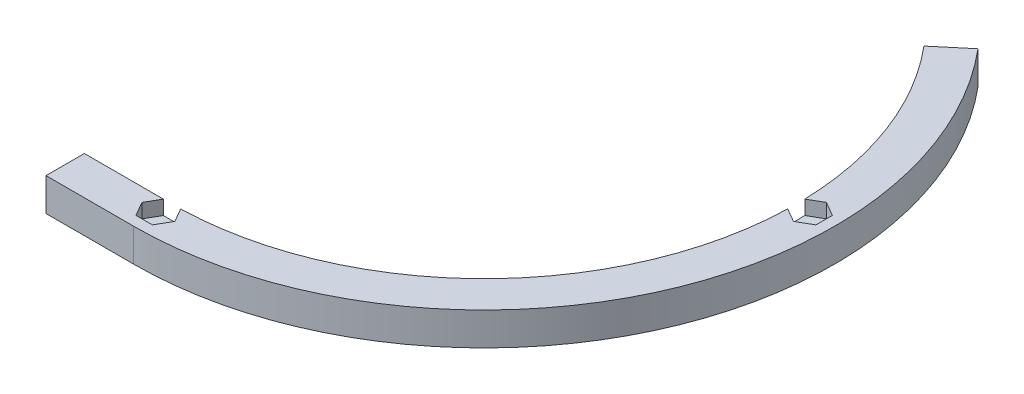
ISO-10303-21;
HEADER;
FILE_DESCRIPTION(('STEP AP214'),'2;1');
FILE_NAME('part.step','',(''),(''),'','','');
FILE_SCHEMA(('AUTOMOTIVE_DESIGN { 1 0 10303 214 1 1 1 1 }'));
ENDSEC;
DATA;
#1=APPLICATION_CONTEXT('core data for automotive mechanical design processes');
#2=APPLICATION_PROTOCOL_DEFINITION('international standard','automotive_design',2000,#1);
#3=PRODUCT_CONTEXT('',#1,'mechanical');
#4=PRODUCT('Part','Part','',(#3));
#5=PRODUCT_RELATED_PRODUCT_CATEGORY('part','',(#4));
#6=PRODUCT_DEFINITION_FORMATION('','',#4);
#7=PRODUCT_DEFINITION_CONTEXT('part definition',#1,'design');
#8=PRODUCT_DEFINITION('design','',#6,#7);
#9=PRODUCT_DEFINITION_SHAPE('','',#8);
#10=(LENGTH_UNIT() NAMED_UNIT(*) SI_UNIT(.MILLI.,.METRE.));
#11=(NAMED_UNIT(*) PLANE_ANGLE_UNIT() SI_UNIT($,.RADIAN.));
#12=(NAMED_UNIT(*) SI_UNIT($,.STERADIAN.) SOLID_ANGLE_UNIT());
#13=UNCERTAINTY_MEASURE_WITH_UNIT(LENGTH_MEASURE(1.E-05),#10,'distance_accuracy_value','');
#14=(GEOMETRIC_REPRESENTATION_CONTEXT(3) GLOBAL_UNCERTAINTY_ASSIGNED_CONTEXT((#13)) GLOBAL_UNIT_ASSIGNED_CONTEXT((#10,
#11,#12)) REPRESENTATION_CONTEXT('',''));
#15=CARTESIAN_POINT('',(0.,0.,0.));
#16=DIRECTION('',(0.,0.,1.));
#17=DIRECTION('',(1.,0.,0.));
#18=AXIS2_PLACEMENT_3D('',#15,#16,#17);
#19=CARTESIAN_POINT('',(0.,15.,0.));
#20=DIRECTION('',(0.,-1.,0.));
#21=DIRECTION('',(0.,0.,-1.));
#22=AXIS2_PLACEMENT_3D('',#19,#20,#21);
#23=CYLINDRICAL_SURFACE('',#22,160.);
#24=CARTESIAN_POINT('',(0.,0.,0.));
#25=DIRECTION('',(0.,1.,0.));
#26=DIRECTION('',(0.,0.,1.));
#27=AXIS2_PLACEMENT_3D('',#24,#25,#26);
#28=CIRCLE('',#27,160.);
#29=CARTESIAN_POINT('',(0.,0.,160.));
#30=VERTEX_POINT('',#29);
#31=CARTESIAN_POINT('',(122.567110899036,0.,-102.846017549847));
#32=VERTEX_POINT('',#31);
#33=EDGE_CURVE('E278',#30,#32,#28,.T.);
#34=ORIENTED_EDGE('',*,*,#33,.T.);
#35=DIRECTION('',(0.,-1.,0.));
#36=VECTOR('',#35,1.);
#37=CARTESIAN_POINT('',(122.567110899036,15.,-102.846017549847));
#38=LINE('',#37,#36);
#39=CARTESIAN_POINT('',(122.567110899036,15.,-102.846017549847));
#40=VERTEX_POINT('',#39);
#41=EDGE_CURVE('E299',#40,#32,#38,.T.);
#42=ORIENTED_EDGE('',*,*,#41,.F.);
#43=CARTESIAN_POINT('',(0.,15.,0.));
#44=DIRECTION('',(0.,1.,0.));
#45=DIRECTION('',(0.,0.,1.));
#46=AXIS2_PLACEMENT_3D('',#43,#44,#45);
#47=CIRCLE('',#46,160.);
#48=CARTESIAN_POINT('',(0.,15.,160.));
#49=VERTEX_POINT('',#48);
#50=EDGE_CURVE('E279',#49,#40,#47,.T.);
#51=ORIENTED_EDGE('',*,*,#50,.F.);
#52=DIRECTION('',(0.,-1.,0.));
#53=VECTOR('',#52,1.);
#54=CARTESIAN_POINT('',(0.,15.,160.));
#55=LINE('',#54,#53);
#56=EDGE_CURVE('E301',#49,#30,#55,.T.);
#57=ORIENTED_EDGE('',*,*,#56,.T.);
#58=EDGE_LOOP('',(#34,#42,#51,#57));
#59=FACE_BOUND('',#58,.T.);
#60=ADVANCED_FACE('F45',(#59),#23,.T.);
#61=CARTESIAN_POINT('',(0.,15.,0.));
#62=DIRECTION('',(-0.642787609686543,0.,-0.766044443118975));
#63=DIRECTION('',(-0.766044443118975,0.,0.642787609686543));
#64=AXIS2_PLACEMENT_3D('',#61,#62,#63);
#65=PLANE('',#64);
#66=DIRECTION('',(0.766044443118975,0.,-0.642787609686543));
#67=VECTOR('',#66,1.);
#68=CARTESIAN_POINT('',(0.,0.,0.));
#69=LINE('',#68,#67);
#70=CARTESIAN_POINT('',(109.161333144454,0.,-91.5972343803324));
#71=VERTEX_POINT('',#70);
#72=EDGE_CURVE('E290',#71,#32,#69,.T.);
#73=ORIENTED_EDGE('',*,*,#72,.F.);
#74=DIRECTION('',(0.,-1.,0.));
#75=VECTOR('',#74,1.);
#76=CARTESIAN_POINT('',(109.161333144454,15.,-91.5972343803324));
#77=LINE('',#76,#75);
#78=CARTESIAN_POINT('',(109.161333144454,15.,-91.5972343803324));
#79=VERTEX_POINT('',#78);
#80=EDGE_CURVE('E297',#79,#71,#77,.T.);
#81=ORIENTED_EDGE('',*,*,#80,.F.);
#82=DIRECTION('',(0.766044443118975,0.,-0.642787609686543));
#83=VECTOR('',#82,1.);
#84=CARTESIAN_POINT('',(0.,15.,0.));
#85=LINE('',#84,#83);
#86=EDGE_CURVE('E281',#79,#40,#85,.T.);
#87=ORIENTED_EDGE('',*,*,#86,.T.);
#88=ORIENTED_EDGE('',*,*,#41,.T.);
#89=EDGE_LOOP('',(#73,#81,#87,#88));
#90=FACE_BOUND('',#89,.T.);
#91=ADVANCED_FACE('F363',(#90),#65,.T.);
#92=CARTESIAN_POINT('',(0.,15.,0.));
#93=DIRECTION('',(0.,-1.,0.));
#94=DIRECTION('',(0.,0.,-1.));
#95=AXIS2_PLACEMENT_3D('',#92,#93,#94);
#96=CYLINDRICAL_SURFACE('',#95,142.5);
#97=DIRECTION('',(0.,-1.,0.));
#98=VECTOR('',#97,1.);
#99=CARTESIAN_POINT('',(3.89523899783583,15.,142.446751851875));
#100=LINE('',#99,#98);
#101=CARTESIAN_POINT('',(3.89523899783584,15.,142.446751851875));
#102=VERTEX_POINT('',#101);
#103=CARTESIAN_POINT('',(3.89523899783582,8.5,142.446751851875));
#104=VERTEX_POINT('',#103);
#105=EDGE_CURVE('E255',#102,#104,#100,.T.);
#106=ORIENTED_EDGE('',*,*,#105,.F.);
#107=CARTESIAN_POINT('',(0.,15.,0.));
#108=DIRECTION('',(0.,1.,0.));
#109=DIRECTION('',(0.,0.,1.));
#110=AXIS2_PLACEMENT_3D('',#107,#108,#109);
#111=CIRCLE('',#110,142.5);
#112=CARTESIAN_POINT('',(142.446751851875,15.,3.8952389978358));
#113=VERTEX_POINT('',#112);
#114=EDGE_CURVE('E287',#102,#113,#111,.T.);
#115=ORIENTED_EDGE('',*,*,#114,.T.);
#116=DIRECTION('',(0.,-1.,0.));
#117=VECTOR('',#116,1.);
#118=CARTESIAN_POINT('',(142.446751851875,15.,3.89523899783583));
#119=LINE('',#118,#117);
#120=CARTESIAN_POINT('',(142.446751851875,8.5,3.89523899783582));
#121=VERTEX_POINT('',#120);
#122=EDGE_CURVE('E59',#121,#113,#119,.F.);
#123=ORIENTED_EDGE('',*,*,#122,.F.);
#124=CARTESIAN_POINT('',(0.,8.5,0.));
#125=DIRECTION('',(0.,1.,0.));
#126=DIRECTION('',(0.,0.,1.));
#127=AXIS2_PLACEMENT_3D('',#124,#125,#126);
#128=CIRCLE('',#127,142.5);
#129=CARTESIAN_POINT('',(142.446751851875,8.5,-3.89523899783584));
#130=VERTEX_POINT('',#129);
#131=EDGE_CURVE('E11',#121,#130,#128,.T.);
#132=ORIENTED_EDGE('',*,*,#131,.T.);
#133=DIRECTION('',(0.,-1.,0.));
#134=VECTOR('',#133,1.);
#135=CARTESIAN_POINT('',(142.446751851875,15.,-3.89523899783584));
#136=LINE('',#135,#134);
#137=CARTESIAN_POINT('',(142.446751851875,15.,-3.89523899783583));
#138=VERTEX_POINT('',#137);
#139=EDGE_CURVE('E253',#138,#130,#136,.T.);
#140=ORIENTED_EDGE('',*,*,#139,.F.);
#141=EDGE_CURVE('E285',#138,#79,#111,.T.);
#142=ORIENTED_EDGE('',*,*,#141,.T.);
#143=ORIENTED_EDGE('',*,*,#80,.T.);
#144=CARTESIAN_POINT('',(0.,0.,0.));
#145=DIRECTION('',(0.,1.,0.));
#146=DIRECTION('',(0.,0.,1.));
#147=AXIS2_PLACEMENT_3D('',#144,#145,#146);
#148=CIRCLE('',#147,142.5);
#149=CARTESIAN_POINT('',(0.,0.,142.5));
#150=VERTEX_POINT('',#149);
#151=EDGE_CURVE('E282',#150,#71,#148,.T.);
#152=ORIENTED_EDGE('',*,*,#151,.F.);
#153=DIRECTION('',(0.,-1.,0.));
#154=VECTOR('',#153,1.);
#155=CARTESIAN_POINT('',(0.,15.,142.5));
#156=LINE('',#155,#154);
#157=CARTESIAN_POINT('',(0.,8.5,142.5));
#158=VERTEX_POINT('',#157);
#159=EDGE_CURVE('E295',#158,#150,#156,.T.);
#160=ORIENTED_EDGE('',*,*,#159,.F.);
#161=CARTESIAN_POINT('',(0.,8.5,0.));
#162=DIRECTION('',(0.,1.,0.));
#163=DIRECTION('',(0.,0.,1.));
#164=AXIS2_PLACEMENT_3D('',#161,#162,#163);
#165=CIRCLE('',#164,142.5);
#166=EDGE_CURVE('E67',#158,#104,#165,.T.);
#167=ORIENTED_EDGE('',*,*,#166,.T.);
#168=EDGE_LOOP('',(#106,#115,#123,#132,#140,#142,#143,#152,#160,#167));
#169=FACE_BOUND('',#168,.T.);
#170=ADVANCED_FACE('F327',(#169),#96,.F.);
#171=CARTESIAN_POINT('',(0.,15.,0.));
#172=DIRECTION('',(0.,1.,0.));
#173=DIRECTION('',(0.,0.,1.));
#174=AXIS2_PLACEMENT_3D('',#171,#172,#173);
#175=PLANE('',#174);
#176=DIRECTION('',(-0.499999999999999,0.,-0.866025403784439));
#177=VECTOR('',#176,1.);
#178=CARTESIAN_POINT('',(7.50555349946513,15.,148.7));
#179=LINE('',#178,#177);
#180=CARTESIAN_POINT('',(7.50555349946513,15.,148.7));
#181=VERTEX_POINT('',#180);
#182=EDGE_CURVE('E179',#181,#102,#179,.T.);
#183=ORIENTED_EDGE('',*,*,#182,.F.);
#184=DIRECTION('',(0.500000000000001,0.,-0.866025403784438));
#185=VECTOR('',#184,1.);
#186=CARTESIAN_POINT('',(3.75277674973257,15.,155.2));
#187=LINE('',#186,#185);
#188=CARTESIAN_POINT('',(3.75277674973257,15.,155.2));
#189=VERTEX_POINT('',#188);
#190=EDGE_CURVE('E209',#189,#181,#187,.T.);
#191=ORIENTED_EDGE('',*,*,#190,.F.);
#192=DIRECTION('',(1.,0.,0.));
#193=VECTOR('',#192,1.);
#194=CARTESIAN_POINT('',(-3.75277674973258,15.,155.2));
#195=LINE('',#194,#193);
#196=CARTESIAN_POINT('',(-3.75277674973258,15.,155.2));
#197=VERTEX_POINT('',#196);
#198=EDGE_CURVE('E206',#197,#189,#195,.T.);
#199=ORIENTED_EDGE('',*,*,#198,.F.);
#200=DIRECTION('',(0.5,0.,0.866025403784439));
#201=VECTOR('',#200,1.);
#202=CARTESIAN_POINT('',(-7.50555349946513,15.,148.7));
#203=LINE('',#202,#201);
#204=CARTESIAN_POINT('',(-7.50555349946513,15.,148.7));
#205=VERTEX_POINT('',#204);
#206=EDGE_CURVE('E203',#205,#197,#203,.T.);
#207=ORIENTED_EDGE('',*,*,#206,.F.);
#208=DIRECTION('',(-0.500000000000001,0.,0.866025403784438));
#209=VECTOR('',#208,1.);
#210=CARTESIAN_POINT('',(-3.75277674973257,15.,142.2));
#211=LINE('',#210,#209);
#212=CARTESIAN_POINT('',(-3.92598183048946,15.,142.5));
#213=VERTEX_POINT('',#212);
#214=EDGE_CURVE('E185',#213,#205,#211,.T.);
#215=ORIENTED_EDGE('',*,*,#214,.F.);
#216=DIRECTION('',(1.,0.,0.));
#217=VECTOR('',#216,1.);
#218=CARTESIAN_POINT('',(-40.,15.,142.5));
#219=LINE('',#218,#217);
#220=CARTESIAN_POINT('',(-40.,15.,142.5));
#221=VERTEX_POINT('',#220);
#222=EDGE_CURVE('E266',#221,#213,#219,.T.);
#223=ORIENTED_EDGE('',*,*,#222,.F.);
#224=DIRECTION('',(0.,0.,-1.));
#225=VECTOR('',#224,1.);
#226=CARTESIAN_POINT('',(-40.,15.,160.));
#227=LINE('',#226,#225);
#228=CARTESIAN_POINT('',(-40.,15.,160.));
#229=VERTEX_POINT('',#228);
#230=EDGE_CURVE('E264',#229,#221,#227,.T.);
#231=ORIENTED_EDGE('',*,*,#230,.F.);
#232=DIRECTION('',(1.,0.,0.));
#233=VECTOR('',#232,1.);
#234=CARTESIAN_POINT('',(-40.,15.,160.));
#235=LINE('',#234,#233);
#236=EDGE_CURVE('E269',#229,#49,#235,.T.);
#237=ORIENTED_EDGE('',*,*,#236,.T.);
#238=ORIENTED_EDGE('',*,*,#50,.T.);
#239=ORIENTED_EDGE('',*,*,#86,.F.);
#240=ORIENTED_EDGE('',*,*,#141,.F.);
#241=DIRECTION('',(-0.866025403784438,0.,0.500000000000001));
#242=VECTOR('',#241,1.);
#243=CARTESIAN_POINT('',(148.7,15.,-7.50555349946513));
#244=LINE('',#243,#242);
#245=CARTESIAN_POINT('',(148.7,15.,-7.50555349946513));
#246=VERTEX_POINT('',#245);
#247=EDGE_CURVE('E204',#246,#138,#244,.T.);
#248=ORIENTED_EDGE('',*,*,#247,.F.);
#249=DIRECTION('',(-0.866025403784439,0.,-0.499999999999999));
#250=VECTOR('',#249,1.);
#251=CARTESIAN_POINT('',(155.2,15.,-3.75277674973255));
#252=LINE('',#251,#250);
#253=CARTESIAN_POINT('',(155.2,15.,-3.75277674973255));
#254=VERTEX_POINT('',#253);
#255=EDGE_CURVE('E228',#254,#246,#252,.T.);
#256=ORIENTED_EDGE('',*,*,#255,.F.);
#257=DIRECTION('',(0.,0.,-1.));
#258=VECTOR('',#257,1.);
#259=CARTESIAN_POINT('',(155.2,15.,3.75277674973258));
#260=LINE('',#259,#258);
#261=CARTESIAN_POINT('',(155.2,15.,3.75277674973258));
#262=VERTEX_POINT('',#261);
#263=EDGE_CURVE('E231',#262,#254,#260,.T.);
#264=ORIENTED_EDGE('',*,*,#263,.F.);
#265=DIRECTION('',(0.866025403784439,0.,-0.5));
#266=VECTOR('',#265,1.);
#267=CARTESIAN_POINT('',(148.7,15.,7.50555349946515));
#268=LINE('',#267,#266);
#269=CARTESIAN_POINT('',(148.7,15.,7.50555349946515));
#270=VERTEX_POINT('',#269);
#271=EDGE_CURVE('E235',#270,#262,#268,.T.);
#272=ORIENTED_EDGE('',*,*,#271,.F.);
#273=DIRECTION('',(0.866025403784438,0.,0.500000000000001));
#274=VECTOR('',#273,1.);
#275=CARTESIAN_POINT('',(33.9250000000001,15.,-58.7598236467742));
#276=LINE('',#275,#274);
#277=EDGE_CURVE('E52',#113,#270,#276,.T.);
#278=ORIENTED_EDGE('',*,*,#277,.F.);
#279=ORIENTED_EDGE('',*,*,#114,.F.);
#280=EDGE_LOOP('',(#183,#191,#199,#207,#215,#223,#231,#237,#238,#239,#240,#248,#256,#264,#272,
#278,#279));
#281=FACE_BOUND('',#280,.T.);
#282=ADVANCED_FACE('F316',(#281),#175,.T.);
#283=CARTESIAN_POINT('',(0.,0.,0.));
#284=DIRECTION('',(0.,1.,0.));
#285=DIRECTION('',(0.,0.,1.));
#286=AXIS2_PLACEMENT_3D('',#283,#284,#285);
#287=PLANE('',#286);
#288=ORIENTED_EDGE('',*,*,#33,.F.);
#289=DIRECTION('',(1.,0.,0.));
#290=VECTOR('',#289,1.);
#291=CARTESIAN_POINT('',(-40.,0.,160.));
#292=LINE('',#291,#290);
#293=CARTESIAN_POINT('',(-40.,0.,160.));
#294=VERTEX_POINT('',#293);
#295=EDGE_CURVE('E272',#294,#30,#292,.T.);
#296=ORIENTED_EDGE('',*,*,#295,.F.);
#297=DIRECTION('',(0.,0.,1.));
#298=VECTOR('',#297,1.);
#299=CARTESIAN_POINT('',(-40.,0.,142.5));
#300=LINE('',#299,#298);
#301=CARTESIAN_POINT('',(-40.,0.,142.5));
#302=VERTEX_POINT('',#301);
#303=EDGE_CURVE('E260',#302,#294,#300,.T.);
#304=ORIENTED_EDGE('',*,*,#303,.F.);
#305=DIRECTION('',(1.,0.,0.));
#306=VECTOR('',#305,1.);
#307=CARTESIAN_POINT('',(-40.,0.,142.5));
#308=LINE('',#307,#306);
#309=EDGE_CURVE('E275',#302,#150,#308,.T.);
#310=ORIENTED_EDGE('',*,*,#309,.T.);
#311=ORIENTED_EDGE('',*,*,#151,.T.);
#312=ORIENTED_EDGE('',*,*,#72,.T.);
#313=EDGE_LOOP('',(#288,#296,#304,#310,#311,#312));
#314=FACE_BOUND('',#313,.T.);
#315=ADVANCED_FACE('F358',(#314),#287,.F.);
#316=CARTESIAN_POINT('',(-40.,15.,142.5));
#317=DIRECTION('',(0.,0.,1.));
#318=DIRECTION('',(1.,0.,0.));
#319=AXIS2_PLACEMENT_3D('',#316,#317,#318);
#320=PLANE('',#319);
#321=ORIENTED_EDGE('',*,*,#222,.T.);
#322=DIRECTION('',(0.,-1.,0.));
#323=VECTOR('',#322,1.);
#324=CARTESIAN_POINT('',(-3.92598183048946,15.,142.5));
#325=LINE('',#324,#323);
#326=CARTESIAN_POINT('',(-3.92598183048946,8.5,142.5));
#327=VERTEX_POINT('',#326);
#328=EDGE_CURVE('E304',#213,#327,#325,.T.);
#329=ORIENTED_EDGE('',*,*,#328,.T.);
#330=DIRECTION('',(-1.,0.,0.));
#331=VECTOR('',#330,1.);
#332=CARTESIAN_POINT('',(-40.,8.5,142.5));
#333=LINE('',#332,#331);
#334=EDGE_CURVE('E176',#158,#327,#333,.T.);
#335=ORIENTED_EDGE('',*,*,#334,.F.);
#336=ORIENTED_EDGE('',*,*,#159,.T.);
#337=ORIENTED_EDGE('',*,*,#309,.F.);
#338=DIRECTION('',(0.,-1.,0.));
#339=VECTOR('',#338,1.);
#340=CARTESIAN_POINT('',(-40.,15.,142.5));
#341=LINE('',#340,#339);
#342=EDGE_CURVE('E257',#221,#302,#341,.T.);
#343=ORIENTED_EDGE('',*,*,#342,.F.);
#344=EDGE_LOOP('',(#321,#329,#335,#336,#337,#343));
#345=FACE_BOUND('',#344,.T.);
#346=ADVANCED_FACE('F343',(#345),#320,.F.);
#347=CARTESIAN_POINT('',(-40.,0.,160.));
#348=DIRECTION('',(0.,0.,-1.));
#349=DIRECTION('',(-1.,0.,0.));
#350=AXIS2_PLACEMENT_3D('',#347,#348,#349);
#351=PLANE('',#350);
#352=ORIENTED_EDGE('',*,*,#56,.F.);
#353=ORIENTED_EDGE('',*,*,#236,.F.);
#354=DIRECTION('',(0.,1.,0.));
#355=VECTOR('',#354,1.);
#356=CARTESIAN_POINT('',(-40.,0.,160.));
#357=LINE('',#356,#355);
#358=EDGE_CURVE('E262',#294,#229,#357,.T.);
#359=ORIENTED_EDGE('',*,*,#358,.F.);
#360=ORIENTED_EDGE('',*,*,#295,.T.);
#361=EDGE_LOOP('',(#352,#353,#359,#360));
#362=FACE_BOUND('',#361,.T.);
#363=ADVANCED_FACE('F354',(#362),#351,.F.);
#364=CARTESIAN_POINT('',(-40.,0.,0.));
#365=DIRECTION('',(-1.,0.,0.));
#366=DIRECTION('',(0.,0.,1.));
#367=AXIS2_PLACEMENT_3D('',#364,#365,#366);
#368=PLANE('',#367);
#369=ORIENTED_EDGE('',*,*,#342,.T.);
#370=ORIENTED_EDGE('',*,*,#303,.T.);
#371=ORIENTED_EDGE('',*,*,#358,.T.);
#372=ORIENTED_EDGE('',*,*,#230,.T.);
#373=EDGE_LOOP('',(#369,#370,#371,#372));
#374=FACE_BOUND('',#373,.T.);
#375=ADVANCED_FACE('F346',(#374),#368,.T.);
#376=CARTESIAN_POINT('',(-3.75277674973257,8.5,142.2));
#377=DIRECTION('',(-0.866025403784438,0.,-0.500000000000001));
#378=DIRECTION('',(-0.500000000000001,0.,0.866025403784438));
#379=AXIS2_PLACEMENT_3D('',#376,#377,#378);
#380=PLANE('',#379);
#381=ORIENTED_EDGE('',*,*,#214,.T.);
#382=DIRECTION('',(0.,1.,0.));
#383=VECTOR('',#382,1.);
#384=CARTESIAN_POINT('',(-7.50555349946513,8.5,148.7));
#385=LINE('',#384,#383);
#386=CARTESIAN_POINT('',(-7.50555349946513,8.5,148.7));
#387=VERTEX_POINT('',#386);
#388=EDGE_CURVE('E182',#387,#205,#385,.T.);
#389=ORIENTED_EDGE('',*,*,#388,.F.);
#390=DIRECTION('',(-0.500000000000001,0.,0.866025403784438));
#391=VECTOR('',#390,1.);
#392=CARTESIAN_POINT('',(-3.75277674973257,8.5,142.2));
#393=LINE('',#392,#391);
#394=EDGE_CURVE('E170',#327,#387,#393,.T.);
#395=ORIENTED_EDGE('',*,*,#394,.F.);
#396=ORIENTED_EDGE('',*,*,#328,.F.);
#397=EDGE_LOOP('',(#381,#389,#395,#396));
#398=FACE_BOUND('',#397,.T.);
#399=ADVANCED_FACE('F183',(#398),#380,.F.);
#400=CARTESIAN_POINT('',(7.50555349946513,8.5,148.7));
#401=DIRECTION('',(0.866025403784439,0.,-0.499999999999999));
#402=DIRECTION('',(-0.499999999999999,0.,-0.866025403784439));
#403=AXIS2_PLACEMENT_3D('',#400,#401,#402);
#404=PLANE('',#403);
#405=ORIENTED_EDGE('',*,*,#105,.T.);
#406=DIRECTION('',(-0.499999999999999,0.,-0.866025403784439));
#407=VECTOR('',#406,1.);
#408=CARTESIAN_POINT('',(7.50555349946513,8.5,148.7));
#409=LINE('',#408,#407);
#410=CARTESIAN_POINT('',(7.50555349946513,8.5,148.7));
#411=VERTEX_POINT('',#410);
#412=EDGE_CURVE('E190',#411,#104,#409,.T.);
#413=ORIENTED_EDGE('',*,*,#412,.F.);
#414=DIRECTION('',(0.,1.,0.));
#415=VECTOR('',#414,1.);
#416=CARTESIAN_POINT('',(7.50555349946513,8.5,148.7));
#417=LINE('',#416,#415);
#418=EDGE_CURVE('E213',#411,#181,#417,.T.);
#419=ORIENTED_EDGE('',*,*,#418,.T.);
#420=ORIENTED_EDGE('',*,*,#182,.T.);
#421=EDGE_LOOP('',(#405,#413,#419,#420));
#422=FACE_BOUND('',#421,.T.);
#423=ADVANCED_FACE('F332',(#422),#404,.F.);
#424=CARTESIAN_POINT('',(3.75277674973257,8.5,155.2));
#425=DIRECTION('',(0.866025403784438,0.,0.500000000000001));
#426=DIRECTION('',(0.500000000000001,0.,-0.866025403784438));
#427=AXIS2_PLACEMENT_3D('',#424,#425,#426);
#428=PLANE('',#427);
#429=ORIENTED_EDGE('',*,*,#190,.T.);
#430=ORIENTED_EDGE('',*,*,#418,.F.);
#431=DIRECTION('',(0.500000000000001,0.,-0.866025403784438));
#432=VECTOR('',#431,1.);
#433=CARTESIAN_POINT('',(3.75277674973257,8.5,155.2));
#434=LINE('',#433,#432);
#435=CARTESIAN_POINT('',(3.75277674973257,8.5,155.2));
#436=VERTEX_POINT('',#435);
#437=EDGE_CURVE('E196',#436,#411,#434,.T.);
#438=ORIENTED_EDGE('',*,*,#437,.F.);
#439=DIRECTION('',(0.,1.,0.));
#440=VECTOR('',#439,1.);
#441=CARTESIAN_POINT('',(3.75277674973257,8.5,155.2));
#442=LINE('',#441,#440);
#443=EDGE_CURVE('E215',#436,#189,#442,.T.);
#444=ORIENTED_EDGE('',*,*,#443,.T.);
#445=EDGE_LOOP('',(#429,#430,#438,#444));
#446=FACE_BOUND('',#445,.T.);
#447=ADVANCED_FACE('F336',(#446),#428,.F.);
#448=CARTESIAN_POINT('',(-3.75277674973258,8.5,155.2));
#449=DIRECTION('',(0.,0.,1.));
#450=DIRECTION('',(1.,0.,0.));
#451=AXIS2_PLACEMENT_3D('',#448,#449,#450);
#452=PLANE('',#451);
#453=ORIENTED_EDGE('',*,*,#198,.T.);
#454=ORIENTED_EDGE('',*,*,#443,.F.);
#455=DIRECTION('',(1.,0.,0.));
#456=VECTOR('',#455,1.);
#457=CARTESIAN_POINT('',(-3.75277674973258,8.5,155.2));
#458=LINE('',#457,#456);
#459=CARTESIAN_POINT('',(-3.75277674973258,8.5,155.2));
#460=VERTEX_POINT('',#459);
#461=EDGE_CURVE('E194',#460,#436,#458,.T.);
#462=ORIENTED_EDGE('',*,*,#461,.F.);
#463=DIRECTION('',(0.,1.,0.));
#464=VECTOR('',#463,1.);
#465=CARTESIAN_POINT('',(-3.75277674973258,8.5,155.2));
#466=LINE('',#465,#464);
#467=EDGE_CURVE('E189',#460,#197,#466,.T.);
#468=ORIENTED_EDGE('',*,*,#467,.T.);
#469=EDGE_LOOP('',(#453,#454,#462,#468));
#470=FACE_BOUND('',#469,.T.);
#471=ADVANCED_FACE('F338',(#470),#452,.F.);
#472=CARTESIAN_POINT('',(-7.50555349946513,8.5,148.7));
#473=DIRECTION('',(-0.866025403784439,0.,0.5));
#474=DIRECTION('',(0.5,0.,0.866025403784439));
#475=AXIS2_PLACEMENT_3D('',#472,#473,#474);
#476=PLANE('',#475);
#477=ORIENTED_EDGE('',*,*,#206,.T.);
#478=ORIENTED_EDGE('',*,*,#467,.F.);
#479=DIRECTION('',(0.5,0.,0.866025403784439));
#480=VECTOR('',#479,1.);
#481=CARTESIAN_POINT('',(-7.50555349946513,8.5,148.7));
#482=LINE('',#481,#480);
#483=EDGE_CURVE('E175',#387,#460,#482,.T.);
#484=ORIENTED_EDGE('',*,*,#483,.F.);
#485=ORIENTED_EDGE('',*,*,#388,.T.);
#486=EDGE_LOOP('',(#477,#478,#484,#485));
#487=FACE_BOUND('',#486,.T.);
#488=ADVANCED_FACE('F192',(#487),#476,.F.);
#489=CARTESIAN_POINT('',(0.,8.5,0.));
#490=DIRECTION('',(0.,1.,0.));
#491=DIRECTION('',(0.,0.,1.));
#492=AXIS2_PLACEMENT_3D('',#489,#490,#491);
#493=PLANE('',#492);
#494=ORIENTED_EDGE('',*,*,#334,.T.);
#495=ORIENTED_EDGE('',*,*,#394,.T.);
#496=ORIENTED_EDGE('',*,*,#483,.T.);
#497=ORIENTED_EDGE('',*,*,#461,.T.);
#498=ORIENTED_EDGE('',*,*,#437,.T.);
#499=ORIENTED_EDGE('',*,*,#412,.T.);
#500=ORIENTED_EDGE('',*,*,#166,.F.);
#501=EDGE_LOOP('',(#494,#495,#496,#497,#498,#499,#500));
#502=FACE_BOUND('',#501,.T.);
#503=ADVANCED_FACE('F172',(#502),#493,.T.);
#504=CARTESIAN_POINT('',(148.7,8.5,-7.50555349946513));
#505=DIRECTION('',(-0.500000000000001,0.,-0.866025403784438));
#506=DIRECTION('',(-0.866025403784438,0.,0.500000000000001));
#507=AXIS2_PLACEMENT_3D('',#504,#505,#506);
#508=PLANE('',#507);
#509=ORIENTED_EDGE('',*,*,#139,.T.);
#510=DIRECTION('',(-0.866025403784438,0.,0.500000000000001));
#511=VECTOR('',#510,1.);
#512=CARTESIAN_POINT('',(148.7,8.5,-7.50555349946513));
#513=LINE('',#512,#511);
#514=CARTESIAN_POINT('',(148.7,8.5,-7.50555349946513));
#515=VERTEX_POINT('',#514);
#516=EDGE_CURVE('E232',#515,#130,#513,.T.);
#517=ORIENTED_EDGE('',*,*,#516,.F.);
#518=DIRECTION('',(0.,1.,0.));
#519=VECTOR('',#518,1.);
#520=CARTESIAN_POINT('',(148.7,8.5,-7.50555349946513));
#521=LINE('',#520,#519);
#522=EDGE_CURVE('E226',#515,#246,#521,.T.);
#523=ORIENTED_EDGE('',*,*,#522,.T.);
#524=ORIENTED_EDGE('',*,*,#247,.T.);
#525=EDGE_LOOP('',(#509,#517,#523,#524));
#526=FACE_BOUND('',#525,.T.);
#527=ADVANCED_FACE('F367',(#526),#508,.F.);
#528=CARTESIAN_POINT('',(155.2,8.5,-3.75277674973255));
#529=DIRECTION('',(0.499999999999999,0.,-0.866025403784439));
#530=DIRECTION('',(-0.866025403784439,0.,-0.499999999999999));
#531=AXIS2_PLACEMENT_3D('',#528,#529,#530);
#532=PLANE('',#531);
#533=ORIENTED_EDGE('',*,*,#255,.T.);
#534=ORIENTED_EDGE('',*,*,#522,.F.);
#535=DIRECTION('',(-0.866025403784439,0.,-0.499999999999999));
#536=VECTOR('',#535,1.);
#537=CARTESIAN_POINT('',(155.2,8.5,-3.75277674973255));
#538=LINE('',#537,#536);
#539=CARTESIAN_POINT('',(155.2,8.5,-3.75277674973255));
#540=VERTEX_POINT('',#539);
#541=EDGE_CURVE('E221',#540,#515,#538,.T.);
#542=ORIENTED_EDGE('',*,*,#541,.F.);
#543=DIRECTION('',(0.,1.,0.));
#544=VECTOR('',#543,1.);
#545=CARTESIAN_POINT('',(155.2,8.5,-3.75277674973255));
#546=LINE('',#545,#544);
#547=EDGE_CURVE('E224',#540,#254,#546,.T.);
#548=ORIENTED_EDGE('',*,*,#547,.T.);
#549=EDGE_LOOP('',(#533,#534,#542,#548));
#550=FACE_BOUND('',#549,.T.);
#551=ADVANCED_FACE('F369',(#550),#532,.F.);
#552=CARTESIAN_POINT('',(155.2,8.5,3.75277674973258));
#553=DIRECTION('',(1.,0.,0.));
#554=DIRECTION('',(0.,0.,-1.));
#555=AXIS2_PLACEMENT_3D('',#552,#553,#554);
#556=PLANE('',#555);
#557=ORIENTED_EDGE('',*,*,#263,.T.);
#558=ORIENTED_EDGE('',*,*,#547,.F.);
#559=DIRECTION('',(0.,0.,-1.));
#560=VECTOR('',#559,1.);
#561=CARTESIAN_POINT('',(155.2,8.5,3.75277674973258));
#562=LINE('',#561,#560);
#563=CARTESIAN_POINT('',(155.2,8.5,3.75277674973258));
#564=VERTEX_POINT('',#563);
#565=EDGE_CURVE('E241',#564,#540,#562,.T.);
#566=ORIENTED_EDGE('',*,*,#565,.F.);
#567=DIRECTION('',(0.,1.,0.));
#568=VECTOR('',#567,1.);
#569=CARTESIAN_POINT('',(155.2,8.5,3.75277674973258));
#570=LINE('',#569,#568);
#571=EDGE_CURVE('E222',#564,#262,#570,.T.);
#572=ORIENTED_EDGE('',*,*,#571,.T.);
#573=EDGE_LOOP('',(#557,#558,#566,#572));
#574=FACE_BOUND('',#573,.T.);
#575=ADVANCED_FACE('F320',(#574),#556,.F.);
#576=CARTESIAN_POINT('',(148.7,8.5,7.50555349946515));
#577=DIRECTION('',(0.5,0.,0.866025403784439));
#578=DIRECTION('',(0.866025403784439,0.,-0.5));
#579=AXIS2_PLACEMENT_3D('',#576,#577,#578);
#580=PLANE('',#579);
#581=ORIENTED_EDGE('',*,*,#271,.T.);
#582=ORIENTED_EDGE('',*,*,#571,.F.);
#583=DIRECTION('',(0.866025403784439,0.,-0.5));
#584=VECTOR('',#583,1.);
#585=CARTESIAN_POINT('',(148.7,8.5,7.50555349946515));
#586=LINE('',#585,#584);
#587=CARTESIAN_POINT('',(148.7,8.5,7.50555349946515));
#588=VERTEX_POINT('',#587);
#589=EDGE_CURVE('E244',#588,#564,#586,.T.);
#590=ORIENTED_EDGE('',*,*,#589,.F.);
#591=DIRECTION('',(0.,1.,0.));
#592=VECTOR('',#591,1.);
#593=CARTESIAN_POINT('',(148.7,8.5,7.50555349946515));
#594=LINE('',#593,#592);
#595=EDGE_CURVE('E218',#588,#270,#594,.T.);
#596=ORIENTED_EDGE('',*,*,#595,.T.);
#597=EDGE_LOOP('',(#581,#582,#590,#596));
#598=FACE_BOUND('',#597,.T.);
#599=ADVANCED_FACE('F313',(#598),#580,.F.);
#600=CARTESIAN_POINT('',(142.2,8.5,3.75277674973259));
#601=DIRECTION('',(-0.500000000000001,0.,0.866025403784438));
#602=DIRECTION('',(0.866025403784438,0.,0.500000000000001));
#603=AXIS2_PLACEMENT_3D('',#600,#601,#602);
#604=PLANE('',#603);
#605=ORIENTED_EDGE('',*,*,#122,.T.);
#606=ORIENTED_EDGE('',*,*,#277,.T.);
#607=ORIENTED_EDGE('',*,*,#595,.F.);
#608=DIRECTION('',(0.866025403784438,0.,0.500000000000001));
#609=VECTOR('',#608,1.);
#610=CARTESIAN_POINT('',(142.2,8.5,3.75277674973259));
#611=LINE('',#610,#609);
#612=EDGE_CURVE('E247',#121,#588,#611,.T.);
#613=ORIENTED_EDGE('',*,*,#612,.F.);
#614=EDGE_LOOP('',(#605,#606,#607,#613));
#615=FACE_BOUND('',#614,.T.);
#616=ADVANCED_FACE('F306',(#615),#604,.F.);
#617=CARTESIAN_POINT('',(0.,8.5,0.));
#618=DIRECTION('',(0.,1.,0.));
#619=DIRECTION('',(0.,0.,1.));
#620=AXIS2_PLACEMENT_3D('',#617,#618,#619);
#621=PLANE('',#620);
#622=ORIENTED_EDGE('',*,*,#612,.T.);
#623=ORIENTED_EDGE('',*,*,#589,.T.);
#624=ORIENTED_EDGE('',*,*,#565,.T.);
#625=ORIENTED_EDGE('',*,*,#541,.T.);
#626=ORIENTED_EDGE('',*,*,#516,.T.);
#627=ORIENTED_EDGE('',*,*,#131,.F.);
#628=EDGE_LOOP('',(#622,#623,#624,#625,#626,#627));
#629=FACE_BOUND('',#628,.T.);
#630=ADVANCED_FACE('F324',(#629),#621,.T.);
#631=CLOSED_SHELL('',(#60,#91,#170,#282,#315,#346,#363,#375,#399,#423,#447,#471,#488,#503,#527,
#551,#575,#599,#616,#630));
#632=MANIFOLD_SOLID_BREP('B2',#631);
#633=ADVANCED_BREP_SHAPE_REPRESENTATION('',(#18,#632),#14);
#634=SHAPE_DEFINITION_REPRESENTATION(#9,#633);
ENDSEC;
END-ISO-10303-21;
